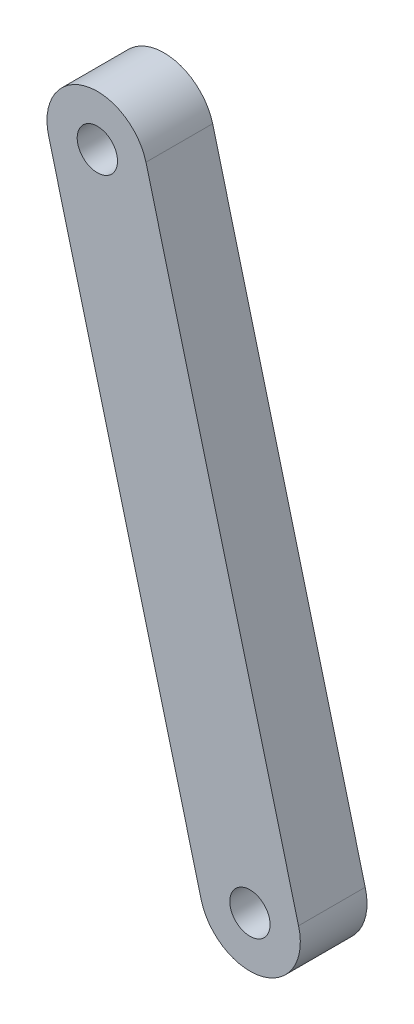
ISO-10303-21;
HEADER;
FILE_DESCRIPTION(('STEP AP214'),'2;1');
FILE_NAME('part.step','',(''),(''),'','','');
FILE_SCHEMA(('AUTOMOTIVE_DESIGN { 1 0 10303 214 1 1 1 1 }'));
ENDSEC;
DATA;
#1=APPLICATION_CONTEXT('core data for automotive mechanical design processes');
#2=APPLICATION_PROTOCOL_DEFINITION('international standard','automotive_design',2000,#1);
#3=PRODUCT_CONTEXT('',#1,'mechanical');
#4=PRODUCT('Part','Part','',(#3));
#5=PRODUCT_RELATED_PRODUCT_CATEGORY('part','',(#4));
#6=PRODUCT_DEFINITION_FORMATION('','',#4);
#7=PRODUCT_DEFINITION_CONTEXT('part definition',#1,'design');
#8=PRODUCT_DEFINITION('design','',#6,#7);
#9=PRODUCT_DEFINITION_SHAPE('','',#8);
#10=(LENGTH_UNIT() NAMED_UNIT(*) SI_UNIT(.MILLI.,.METRE.));
#11=(NAMED_UNIT(*) PLANE_ANGLE_UNIT() SI_UNIT($,.RADIAN.));
#12=(NAMED_UNIT(*) SI_UNIT($,.STERADIAN.) SOLID_ANGLE_UNIT());
#13=UNCERTAINTY_MEASURE_WITH_UNIT(LENGTH_MEASURE(1.E-05),#10,'distance_accuracy_value','');
#14=(GEOMETRIC_REPRESENTATION_CONTEXT(3) GLOBAL_UNCERTAINTY_ASSIGNED_CONTEXT((#13)) GLOBAL_UNIT_ASSIGNED_CONTEXT((#10,
#11,#12)) REPRESENTATION_CONTEXT('',''));
#15=CARTESIAN_POINT('',(0.,0.,0.));
#16=DIRECTION('',(0.,0.,1.));
#17=DIRECTION('',(1.,0.,0.));
#18=AXIS2_PLACEMENT_3D('',#15,#16,#17);
#19=CARTESIAN_POINT('',(-16.4764105316713,-145.660110453471,3.31));
#20=DIRECTION('',(0.,0.,-1.));
#21=DIRECTION('',(-1.,0.,0.));
#22=AXIS2_PLACEMENT_3D('',#19,#20,#21);
#23=CYLINDRICAL_SURFACE('',#22,2.50000000000002);
#24=CARTESIAN_POINT('',(-16.4764105316713,-145.660110453471,0.));
#25=DIRECTION('',(0.,0.,1.));
#26=DIRECTION('',(1.,0.,0.));
#27=AXIS2_PLACEMENT_3D('',#24,#25,#26);
#28=CIRCLE('',#27,2.50000000000002);
#29=CARTESIAN_POINT('',(-18.8880519928611,-146.318886183648,0.));
#30=VERTEX_POINT('',#29);
#31=CARTESIAN_POINT('',(-14.0647690704815,-145.001334723294,0.));
#32=VERTEX_POINT('',#31);
#33=EDGE_CURVE('E112',#30,#32,#28,.T.);
#34=ORIENTED_EDGE('',*,*,#33,.T.);
#35=DIRECTION('',(0.,0.,-1.));
#36=VECTOR('',#35,1.);
#37=CARTESIAN_POINT('',(-14.0647690704815,-145.001334723294,3.31));
#38=LINE('',#37,#36);
#39=CARTESIAN_POINT('',(-14.0647690704815,-145.001334723294,3.31));
#40=VERTEX_POINT('',#39);
#41=EDGE_CURVE('E11',#40,#32,#38,.T.);
#42=ORIENTED_EDGE('',*,*,#41,.F.);
#43=CARTESIAN_POINT('',(-16.4764105316713,-145.660110453471,3.31));
#44=DIRECTION('',(0.,0.,1.));
#45=DIRECTION('',(1.,0.,0.));
#46=AXIS2_PLACEMENT_3D('',#43,#44,#45);
#47=CIRCLE('',#46,2.50000000000002);
#48=CARTESIAN_POINT('',(-18.8880519928611,-146.318886183648,3.31));
#49=VERTEX_POINT('',#48);
#50=EDGE_CURVE('E82',#49,#40,#47,.T.);
#51=ORIENTED_EDGE('',*,*,#50,.F.);
#52=DIRECTION('',(0.,0.,-1.));
#53=VECTOR('',#52,1.);
#54=CARTESIAN_POINT('',(-18.8880519928611,-146.318886183648,3.31));
#55=LINE('',#54,#53);
#56=EDGE_CURVE('E108',#49,#30,#55,.T.);
#57=ORIENTED_EDGE('',*,*,#56,.T.);
#58=EDGE_LOOP('',(#34,#42,#51,#57));
#59=FACE_BOUND('',#58,.T.);
#60=ADVANCED_FACE('F39',(#59),#23,.T.);
#61=CARTESIAN_POINT('',(-48.5836753740097,-12.6734876707431,3.31));
#62=DIRECTION('',(0.967619775663747,0.252412301095728,0.));
#63=DIRECTION('',(-0.252412301095728,0.967619775663747,0.));
#64=AXIS2_PLACEMENT_3D('',#61,#62,#63);
#65=PLANE('',#64);
#66=DIRECTION('',(0.252412301095728,-0.967619775663747,0.));
#67=VECTOR('',#66,1.);
#68=CARTESIAN_POINT('',(-48.5836753740097,-12.6734876707431,0.));
#69=LINE('',#68,#67);
#70=CARTESIAN_POINT('',(-21.6371381033533,-115.972741453381,0.));
#71=VERTEX_POINT('',#70);
#72=EDGE_CURVE('E92',#71,#32,#69,.T.);
#73=ORIENTED_EDGE('',*,*,#72,.F.);
#74=DIRECTION('',(0.,0.,-1.));
#75=VECTOR('',#74,1.);
#76=CARTESIAN_POINT('',(-21.6371381033533,-115.972741453381,3.31));
#77=LINE('',#76,#75);
#78=CARTESIAN_POINT('',(-21.6371381033533,-115.972741453381,3.31));
#79=VERTEX_POINT('',#78);
#80=EDGE_CURVE('E48',#79,#71,#77,.T.);
#81=ORIENTED_EDGE('',*,*,#80,.F.);
#82=DIRECTION('',(0.252412301095728,-0.967619775663747,0.));
#83=VECTOR('',#82,1.);
#84=CARTESIAN_POINT('',(-48.5836753740097,-12.6734876707431,3.31));
#85=LINE('',#84,#83);
#86=EDGE_CURVE('E90',#79,#40,#85,.T.);
#87=ORIENTED_EDGE('',*,*,#86,.T.);
#88=ORIENTED_EDGE('',*,*,#41,.T.);
#89=EDGE_LOOP('',(#73,#81,#87,#88));
#90=FACE_BOUND('',#89,.T.);
#91=ADVANCED_FACE('F89',(#90),#65,.T.);
#92=CARTESIAN_POINT('',(-24.0487795645431,-116.631517183559,3.31));
#93=DIRECTION('',(0.,0.,-1.));
#94=DIRECTION('',(-1.,0.,0.));
#95=AXIS2_PLACEMENT_3D('',#92,#93,#94);
#96=CYLINDRICAL_SURFACE('',#95,2.50000000000001);
#97=CARTESIAN_POINT('',(-24.0487795645431,-116.631517183559,0.));
#98=DIRECTION('',(0.,0.,1.));
#99=DIRECTION('',(1.,0.,0.));
#100=AXIS2_PLACEMENT_3D('',#97,#98,#99);
#101=CIRCLE('',#100,2.50000000000001);
#102=CARTESIAN_POINT('',(-26.4604210257329,-117.290292913736,0.));
#103=VERTEX_POINT('',#102);
#104=EDGE_CURVE('E71',#71,#103,#101,.T.);
#105=ORIENTED_EDGE('',*,*,#104,.T.);
#106=DIRECTION('',(0.,0.,-1.));
#107=VECTOR('',#106,1.);
#108=CARTESIAN_POINT('',(-26.4604210257329,-117.290292913736,3.31));
#109=LINE('',#108,#107);
#110=CARTESIAN_POINT('',(-26.4604210257329,-117.290292913736,3.31));
#111=VERTEX_POINT('',#110);
#112=EDGE_CURVE('E93',#111,#103,#109,.T.);
#113=ORIENTED_EDGE('',*,*,#112,.F.);
#114=CARTESIAN_POINT('',(-24.0487795645431,-116.631517183559,3.31));
#115=DIRECTION('',(0.,0.,1.));
#116=DIRECTION('',(1.,0.,0.));
#117=AXIS2_PLACEMENT_3D('',#114,#115,#116);
#118=CIRCLE('',#117,2.50000000000001);
#119=EDGE_CURVE('E94',#79,#111,#118,.T.);
#120=ORIENTED_EDGE('',*,*,#119,.F.);
#121=ORIENTED_EDGE('',*,*,#80,.T.);
#122=EDGE_LOOP('',(#105,#113,#120,#121));
#123=FACE_BOUND('',#122,.T.);
#124=ADVANCED_FACE('F95',(#123),#96,.T.);
#125=CARTESIAN_POINT('',(-53.4214550686593,-13.9354659142975,3.31));
#126=DIRECTION('',(0.967619775663747,0.252412301095728,0.));
#127=DIRECTION('',(-0.252412301095728,0.967619775663747,0.));
#128=AXIS2_PLACEMENT_3D('',#125,#126,#127);
#129=PLANE('',#128);
#130=DIRECTION('',(0.252412301095728,-0.967619775663747,0.));
#131=VECTOR('',#130,1.);
#132=CARTESIAN_POINT('',(-53.4214550686593,-13.9354659142975,0.));
#133=LINE('',#132,#131);
#134=EDGE_CURVE('E77',#103,#30,#133,.T.);
#135=ORIENTED_EDGE('',*,*,#134,.T.);
#136=ORIENTED_EDGE('',*,*,#56,.F.);
#137=DIRECTION('',(0.252412301095728,-0.967619775663747,0.));
#138=VECTOR('',#137,1.);
#139=CARTESIAN_POINT('',(-53.4214550686593,-13.9354659142975,3.31));
#140=LINE('',#139,#138);
#141=EDGE_CURVE('E56',#111,#49,#140,.T.);
#142=ORIENTED_EDGE('',*,*,#141,.F.);
#143=ORIENTED_EDGE('',*,*,#112,.T.);
#144=EDGE_LOOP('',(#135,#136,#142,#143));
#145=FACE_BOUND('',#144,.T.);
#146=ADVANCED_FACE('F122',(#145),#129,.F.);
#147=CARTESIAN_POINT('',(-16.4764105316713,-145.660110453471,3.31));
#148=DIRECTION('',(0.,0.,-1.));
#149=DIRECTION('',(-1.,0.,0.));
#150=AXIS2_PLACEMENT_3D('',#147,#148,#149);
#151=CYLINDRICAL_SURFACE('',#150,1.);
#152=CARTESIAN_POINT('',(-16.4764105316713,-145.660110453471,3.31));
#153=DIRECTION('',(0.,0.,1.));
#154=DIRECTION('',(1.,0.,0.));
#155=AXIS2_PLACEMENT_3D('',#152,#153,#154);
#156=CIRCLE('',#155,1.);
#157=CARTESIAN_POINT('',(-15.4764105316713,-145.660110453471,3.31));
#158=VERTEX_POINT('',#157);
#159=EDGE_CURVE('E100',#158,#158,#156,.T.);
#160=ORIENTED_EDGE('',*,*,#159,.T.);
#161=EDGE_LOOP('',(#160));
#162=FACE_BOUND('',#161,.T.);
#163=CARTESIAN_POINT('',(-16.4764105316713,-145.660110453471,0.));
#164=DIRECTION('',(0.,0.,1.));
#165=DIRECTION('',(1.,0.,0.));
#166=AXIS2_PLACEMENT_3D('',#163,#164,#165);
#167=CIRCLE('',#166,1.);
#168=CARTESIAN_POINT('',(-15.4764105316713,-145.660110453471,0.));
#169=VERTEX_POINT('',#168);
#170=EDGE_CURVE('E109',#169,#169,#167,.T.);
#171=ORIENTED_EDGE('',*,*,#170,.F.);
#172=EDGE_LOOP('',(#171));
#173=FACE_BOUND('',#172,.T.);
#174=ADVANCED_FACE('F41',(#162,#173),#151,.F.);
#175=CARTESIAN_POINT('',(-24.0487795645431,-116.631517183559,3.31));
#176=DIRECTION('',(0.,0.,-1.));
#177=DIRECTION('',(-1.,0.,0.));
#178=AXIS2_PLACEMENT_3D('',#175,#176,#177);
#179=CYLINDRICAL_SURFACE('',#178,1.00000000000001);
#180=CARTESIAN_POINT('',(-24.0487795645431,-116.631517183559,3.31));
#181=DIRECTION('',(0.,0.,1.));
#182=DIRECTION('',(1.,0.,0.));
#183=AXIS2_PLACEMENT_3D('',#180,#181,#182);
#184=CIRCLE('',#183,1.00000000000001);
#185=CARTESIAN_POINT('',(-23.0487795645431,-116.631517183559,3.31));
#186=VERTEX_POINT('',#185);
#187=EDGE_CURVE('E105',#186,#186,#184,.T.);
#188=ORIENTED_EDGE('',*,*,#187,.T.);
#189=EDGE_LOOP('',(#188));
#190=FACE_BOUND('',#189,.T.);
#191=CARTESIAN_POINT('',(-24.0487795645431,-116.631517183559,0.));
#192=DIRECTION('',(0.,0.,1.));
#193=DIRECTION('',(1.,0.,0.));
#194=AXIS2_PLACEMENT_3D('',#191,#192,#193);
#195=CIRCLE('',#194,1.00000000000001);
#196=CARTESIAN_POINT('',(-23.0487795645431,-116.631517183559,0.));
#197=VERTEX_POINT('',#196);
#198=EDGE_CURVE('E118',#197,#197,#195,.T.);
#199=ORIENTED_EDGE('',*,*,#198,.F.);
#200=EDGE_LOOP('',(#199));
#201=FACE_BOUND('',#200,.T.);
#202=ADVANCED_FACE('F138',(#190,#201),#179,.F.);
#203=CARTESIAN_POINT('',(0.,0.,3.31));
#204=DIRECTION('',(0.,0.,1.));
#205=DIRECTION('',(1.,0.,0.));
#206=AXIS2_PLACEMENT_3D('',#203,#204,#205);
#207=PLANE('',#206);
#208=ORIENTED_EDGE('',*,*,#159,.F.);
#209=EDGE_LOOP('',(#208));
#210=FACE_BOUND('',#209,.T.);
#211=ORIENTED_EDGE('',*,*,#50,.T.);
#212=ORIENTED_EDGE('',*,*,#86,.F.);
#213=ORIENTED_EDGE('',*,*,#119,.T.);
#214=ORIENTED_EDGE('',*,*,#141,.T.);
#215=EDGE_LOOP('',(#211,#212,#213,#214));
#216=FACE_BOUND('',#215,.T.);
#217=ORIENTED_EDGE('',*,*,#187,.F.);
#218=EDGE_LOOP('',(#217));
#219=FACE_BOUND('',#218,.T.);
#220=ADVANCED_FACE('F97',(#210,#216,#219),#207,.T.);
#221=CARTESIAN_POINT('',(0.,0.,0.));
#222=DIRECTION('',(0.,0.,1.));
#223=DIRECTION('',(1.,0.,0.));
#224=AXIS2_PLACEMENT_3D('',#221,#222,#223);
#225=PLANE('',#224);
#226=ORIENTED_EDGE('',*,*,#170,.T.);
#227=EDGE_LOOP('',(#226));
#228=FACE_BOUND('',#227,.T.);
#229=ORIENTED_EDGE('',*,*,#33,.F.);
#230=ORIENTED_EDGE('',*,*,#134,.F.);
#231=ORIENTED_EDGE('',*,*,#104,.F.);
#232=ORIENTED_EDGE('',*,*,#72,.T.);
#233=EDGE_LOOP('',(#229,#230,#231,#232));
#234=FACE_BOUND('',#233,.T.);
#235=ORIENTED_EDGE('',*,*,#198,.T.);
#236=EDGE_LOOP('',(#235));
#237=FACE_BOUND('',#236,.T.);
#238=ADVANCED_FACE('F125',(#228,#234,#237),#225,.F.);
#239=CLOSED_SHELL('',(#60,#91,#124,#146,#174,#202,#220,#238));
#240=MANIFOLD_SOLID_BREP('B2',#239);
#241=ADVANCED_BREP_SHAPE_REPRESENTATION('',(#18,#240),#14);
#242=SHAPE_DEFINITION_REPRESENTATION(#9,#241);
ENDSEC;
END-ISO-10303-21;
